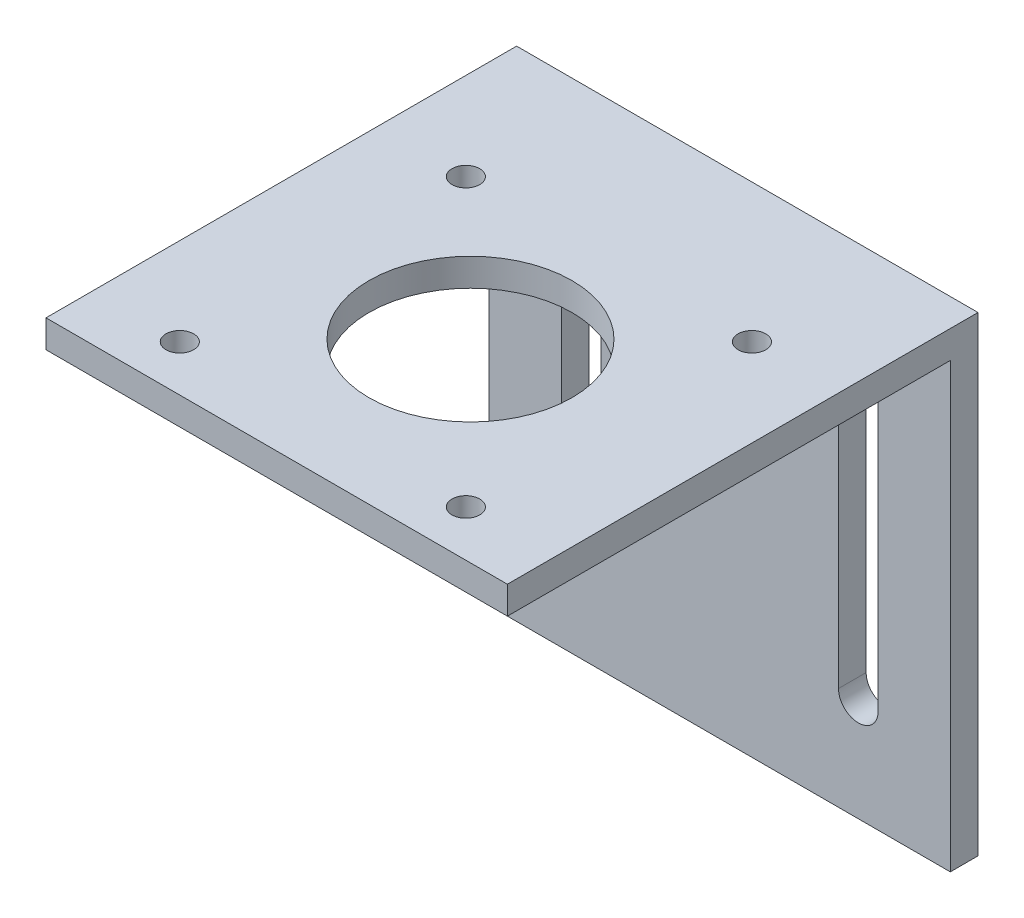
ISO-10303-21;
HEADER;
FILE_DESCRIPTION(('STEP AP214'),'2;1');
FILE_NAME('part.step','',(''),(''),'','','');
FILE_SCHEMA(('AUTOMOTIVE_DESIGN { 1 0 10303 214 1 1 1 1 }'));
ENDSEC;
DATA;
#1=APPLICATION_CONTEXT('core data for automotive mechanical design processes');
#2=APPLICATION_PROTOCOL_DEFINITION('international standard','automotive_design',2000,#1);
#3=PRODUCT_CONTEXT('',#1,'mechanical');
#4=PRODUCT('Part','Part','',(#3));
#5=PRODUCT_RELATED_PRODUCT_CATEGORY('part','',(#4));
#6=PRODUCT_DEFINITION_FORMATION('','',#4);
#7=PRODUCT_DEFINITION_CONTEXT('part definition',#1,'design');
#8=PRODUCT_DEFINITION('design','',#6,#7);
#9=PRODUCT_DEFINITION_SHAPE('','',#8);
#10=(LENGTH_UNIT() NAMED_UNIT(*) SI_UNIT(.MILLI.,.METRE.));
#11=(NAMED_UNIT(*) PLANE_ANGLE_UNIT() SI_UNIT($,.RADIAN.));
#12=(NAMED_UNIT(*) SI_UNIT($,.STERADIAN.) SOLID_ANGLE_UNIT());
#13=UNCERTAINTY_MEASURE_WITH_UNIT(LENGTH_MEASURE(1.E-05),#10,'distance_accuracy_value','');
#14=(GEOMETRIC_REPRESENTATION_CONTEXT(3) GLOBAL_UNCERTAINTY_ASSIGNED_CONTEXT((#13)) GLOBAL_UNIT_ASSIGNED_CONTEXT((#10,
#11,#12)) REPRESENTATION_CONTEXT('',''));
#15=CARTESIAN_POINT('',(0.,0.,0.));
#16=DIRECTION('',(0.,0.,1.));
#17=DIRECTION('',(1.,0.,0.));
#18=AXIS2_PLACEMENT_3D('',#15,#16,#17);
#19=CARTESIAN_POINT('',(0.,0.,3.));
#20=DIRECTION('',(0.,0.,-1.));
#21=DIRECTION('',(-1.,0.,0.));
#22=AXIS2_PLACEMENT_3D('',#19,#20,#21);
#23=PLANE('',#22);
#24=CARTESIAN_POINT('',(15.03,15.35,3.));
#25=DIRECTION('',(0.,0.,1.));
#26=DIRECTION('',(-1.,0.,0.));
#27=AXIS2_PLACEMENT_3D('',#24,#25,#26);
#28=CIRCLE('',#27,2.15000000000001);
#29=CARTESIAN_POINT('',(17.18,15.35,3.));
#30=VERTEX_POINT('',#29);
#31=CARTESIAN_POINT('',(12.88,15.35,3.));
#32=VERTEX_POINT('',#31);
#33=EDGE_CURVE('E172',#30,#32,#28,.T.);
#34=ORIENTED_EDGE('',*,*,#33,.F.);
#35=DIRECTION('',(0.,1.,0.));
#36=VECTOR('',#35,1.);
#37=CARTESIAN_POINT('',(17.18,15.35,3.));
#38=LINE('',#37,#36);
#39=CARTESIAN_POINT('',(17.18,-14.35,3.));
#40=VERTEX_POINT('',#39);
#41=EDGE_CURVE('E179',#40,#30,#38,.T.);
#42=ORIENTED_EDGE('',*,*,#41,.F.);
#43=CARTESIAN_POINT('',(15.03,-14.35,3.));
#44=DIRECTION('',(0.,0.,1.));
#45=DIRECTION('',(1.,0.,0.));
#46=AXIS2_PLACEMENT_3D('',#43,#44,#45);
#47=CIRCLE('',#46,2.15000000000001);
#48=CARTESIAN_POINT('',(12.88,-14.35,3.));
#49=VERTEX_POINT('',#48);
#50=EDGE_CURVE('E177',#49,#40,#47,.T.);
#51=ORIENTED_EDGE('',*,*,#50,.F.);
#52=DIRECTION('',(0.,-1.,0.));
#53=VECTOR('',#52,1.);
#54=CARTESIAN_POINT('',(12.88,15.35,3.));
#55=LINE('',#54,#53);
#56=EDGE_CURVE('E174',#32,#49,#55,.T.);
#57=ORIENTED_EDGE('',*,*,#56,.F.);
#58=EDGE_LOOP('',(#34,#42,#51,#57));
#59=FACE_BOUND('',#58,.T.);
#60=CARTESIAN_POINT('',(-15.,15.35,3.));
#61=DIRECTION('',(0.,0.,1.));
#62=DIRECTION('',(-1.,0.,0.));
#63=AXIS2_PLACEMENT_3D('',#60,#61,#62);
#64=CIRCLE('',#63,2.15);
#65=CARTESIAN_POINT('',(-12.85,15.35,3.));
#66=VERTEX_POINT('',#65);
#67=CARTESIAN_POINT('',(-17.15,15.35,3.));
#68=VERTEX_POINT('',#67);
#69=EDGE_CURVE('E198',#66,#68,#64,.T.);
#70=ORIENTED_EDGE('',*,*,#69,.F.);
#71=DIRECTION('',(0.,1.,0.));
#72=VECTOR('',#71,1.);
#73=CARTESIAN_POINT('',(-12.85,15.35,3.));
#74=LINE('',#73,#72);
#75=CARTESIAN_POINT('',(-12.85,-14.35,3.));
#76=VERTEX_POINT('',#75);
#77=EDGE_CURVE('E206',#76,#66,#74,.T.);
#78=ORIENTED_EDGE('',*,*,#77,.F.);
#79=CARTESIAN_POINT('',(-15.,-14.35,3.));
#80=DIRECTION('',(0.,0.,1.));
#81=DIRECTION('',(1.,0.,0.));
#82=AXIS2_PLACEMENT_3D('',#79,#80,#81);
#83=CIRCLE('',#82,2.15);
#84=CARTESIAN_POINT('',(-17.15,-14.35,3.));
#85=VERTEX_POINT('',#84);
#86=EDGE_CURVE('E203',#85,#76,#83,.T.);
#87=ORIENTED_EDGE('',*,*,#86,.F.);
#88=DIRECTION('',(0.,-1.,0.));
#89=VECTOR('',#88,1.);
#90=CARTESIAN_POINT('',(-17.15,15.35,3.));
#91=LINE('',#90,#89);
#92=EDGE_CURVE('E200',#68,#85,#91,.T.);
#93=ORIENTED_EDGE('',*,*,#92,.F.);
#94=EDGE_LOOP('',(#70,#78,#87,#93));
#95=FACE_BOUND('',#94,.T.);
#96=DIRECTION('',(1.,0.,0.));
#97=VECTOR('',#96,1.);
#98=CARTESIAN_POINT('',(-25.,22.5,3.));
#99=LINE('',#98,#97);
#100=CARTESIAN_POINT('',(-25.,22.5,3.));
#101=VERTEX_POINT('',#100);
#102=CARTESIAN_POINT('',(25.,22.5,3.));
#103=VERTEX_POINT('',#102);
#104=EDGE_CURVE('E54',#101,#103,#99,.T.);
#105=ORIENTED_EDGE('',*,*,#104,.F.);
#106=DIRECTION('',(0.,-1.,0.));
#107=VECTOR('',#106,1.);
#108=CARTESIAN_POINT('',(-25.,-25.5,3.));
#109=LINE('',#108,#107);
#110=CARTESIAN_POINT('',(-25.,-25.5,3.));
#111=VERTEX_POINT('',#110);
#112=EDGE_CURVE('E163',#101,#111,#109,.T.);
#113=ORIENTED_EDGE('',*,*,#112,.T.);
#114=DIRECTION('',(1.,0.,0.));
#115=VECTOR('',#114,1.);
#116=CARTESIAN_POINT('',(-25.,-25.5,3.));
#117=LINE('',#116,#115);
#118=CARTESIAN_POINT('',(25.,-25.5,3.));
#119=VERTEX_POINT('',#118);
#120=EDGE_CURVE('E233',#111,#119,#117,.T.);
#121=ORIENTED_EDGE('',*,*,#120,.T.);
#122=DIRECTION('',(0.,1.,0.));
#123=VECTOR('',#122,1.);
#124=CARTESIAN_POINT('',(25.,-25.5,3.));
#125=LINE('',#124,#123);
#126=EDGE_CURVE('E229',#119,#103,#125,.T.);
#127=ORIENTED_EDGE('',*,*,#126,.T.);
#128=EDGE_LOOP('',(#105,#113,#121,#127));
#129=FACE_BOUND('',#128,.T.);
#130=ADVANCED_FACE('F37',(#59,#95,#129),#23,.F.);
#131=CARTESIAN_POINT('',(0.,0.,0.));
#132=DIRECTION('',(0.,0.,-1.));
#133=DIRECTION('',(-1.,0.,0.));
#134=AXIS2_PLACEMENT_3D('',#131,#132,#133);
#135=PLANE('',#134);
#136=DIRECTION('',(0.,1.,0.));
#137=VECTOR('',#136,1.);
#138=CARTESIAN_POINT('',(25.,-25.5,0.));
#139=LINE('',#138,#137);
#140=CARTESIAN_POINT('',(25.,-25.5,0.));
#141=VERTEX_POINT('',#140);
#142=CARTESIAN_POINT('',(25.,25.5,0.));
#143=VERTEX_POINT('',#142);
#144=EDGE_CURVE('E228',#141,#143,#139,.T.);
#145=ORIENTED_EDGE('',*,*,#144,.F.);
#146=DIRECTION('',(1.,0.,0.));
#147=VECTOR('',#146,1.);
#148=CARTESIAN_POINT('',(-25.,-25.5,0.));
#149=LINE('',#148,#147);
#150=CARTESIAN_POINT('',(-25.,-25.5,0.));
#151=VERTEX_POINT('',#150);
#152=EDGE_CURVE('E231',#151,#141,#149,.T.);
#153=ORIENTED_EDGE('',*,*,#152,.F.);
#154=DIRECTION('',(0.,-1.,0.));
#155=VECTOR('',#154,1.);
#156=CARTESIAN_POINT('',(-25.,-25.5,0.));
#157=LINE('',#156,#155);
#158=CARTESIAN_POINT('',(-25.,25.5,0.));
#159=VERTEX_POINT('',#158);
#160=EDGE_CURVE('E240',#159,#151,#157,.T.);
#161=ORIENTED_EDGE('',*,*,#160,.F.);
#162=DIRECTION('',(-1.,0.,0.));
#163=VECTOR('',#162,1.);
#164=CARTESIAN_POINT('',(-25.,25.5,0.));
#165=LINE('',#164,#163);
#166=EDGE_CURVE('E238',#143,#159,#165,.T.);
#167=ORIENTED_EDGE('',*,*,#166,.F.);
#168=EDGE_LOOP('',(#145,#153,#161,#167));
#169=FACE_BOUND('',#168,.T.);
#170=DIRECTION('',(0.,1.,0.));
#171=VECTOR('',#170,1.);
#172=CARTESIAN_POINT('',(-12.85,15.35,0.));
#173=LINE('',#172,#171);
#174=CARTESIAN_POINT('',(-12.85,-14.35,0.));
#175=VERTEX_POINT('',#174);
#176=CARTESIAN_POINT('',(-12.85,15.35,0.));
#177=VERTEX_POINT('',#176);
#178=EDGE_CURVE('E201',#175,#177,#173,.T.);
#179=ORIENTED_EDGE('',*,*,#178,.T.);
#180=CARTESIAN_POINT('',(-15.,15.35,0.));
#181=DIRECTION('',(0.,0.,1.));
#182=DIRECTION('',(-1.,0.,0.));
#183=AXIS2_PLACEMENT_3D('',#180,#181,#182);
#184=CIRCLE('',#183,2.15);
#185=CARTESIAN_POINT('',(-17.15,15.35,0.));
#186=VERTEX_POINT('',#185);
#187=EDGE_CURVE('E197',#177,#186,#184,.T.);
#188=ORIENTED_EDGE('',*,*,#187,.T.);
#189=DIRECTION('',(0.,-1.,0.));
#190=VECTOR('',#189,1.);
#191=CARTESIAN_POINT('',(-17.15,15.35,0.));
#192=LINE('',#191,#190);
#193=CARTESIAN_POINT('',(-17.15,-14.35,0.));
#194=VERTEX_POINT('',#193);
#195=EDGE_CURVE('E211',#186,#194,#192,.T.);
#196=ORIENTED_EDGE('',*,*,#195,.T.);
#197=CARTESIAN_POINT('',(-15.,-14.35,0.));
#198=DIRECTION('',(0.,0.,1.));
#199=DIRECTION('',(1.,0.,0.));
#200=AXIS2_PLACEMENT_3D('',#197,#198,#199);
#201=CIRCLE('',#200,2.15);
#202=EDGE_CURVE('E214',#194,#175,#201,.T.);
#203=ORIENTED_EDGE('',*,*,#202,.T.);
#204=EDGE_LOOP('',(#179,#188,#196,#203));
#205=FACE_BOUND('',#204,.T.);
#206=DIRECTION('',(0.,1.,0.));
#207=VECTOR('',#206,1.);
#208=CARTESIAN_POINT('',(17.18,15.35,0.));
#209=LINE('',#208,#207);
#210=CARTESIAN_POINT('',(17.18,-14.35,0.));
#211=VERTEX_POINT('',#210);
#212=CARTESIAN_POINT('',(17.18,15.35,0.));
#213=VERTEX_POINT('',#212);
#214=EDGE_CURVE('E175',#211,#213,#209,.T.);
#215=ORIENTED_EDGE('',*,*,#214,.T.);
#216=CARTESIAN_POINT('',(15.03,15.35,0.));
#217=DIRECTION('',(0.,0.,1.));
#218=DIRECTION('',(-1.,0.,0.));
#219=AXIS2_PLACEMENT_3D('',#216,#217,#218);
#220=CIRCLE('',#219,2.15000000000001);
#221=CARTESIAN_POINT('',(12.88,15.35,0.));
#222=VERTEX_POINT('',#221);
#223=EDGE_CURVE('E164',#213,#222,#220,.T.);
#224=ORIENTED_EDGE('',*,*,#223,.T.);
#225=DIRECTION('',(0.,-1.,0.));
#226=VECTOR('',#225,1.);
#227=CARTESIAN_POINT('',(12.88,15.35,0.));
#228=LINE('',#227,#226);
#229=CARTESIAN_POINT('',(12.88,-14.35,0.));
#230=VERTEX_POINT('',#229);
#231=EDGE_CURVE('E167',#222,#230,#228,.T.);
#232=ORIENTED_EDGE('',*,*,#231,.T.);
#233=CARTESIAN_POINT('',(15.03,-14.35,0.));
#234=DIRECTION('',(0.,0.,1.));
#235=DIRECTION('',(1.,0.,0.));
#236=AXIS2_PLACEMENT_3D('',#233,#234,#235);
#237=CIRCLE('',#236,2.15000000000001);
#238=EDGE_CURVE('E184',#230,#211,#237,.T.);
#239=ORIENTED_EDGE('',*,*,#238,.T.);
#240=EDGE_LOOP('',(#215,#224,#232,#239));
#241=FACE_BOUND('',#240,.T.);
#242=ADVANCED_FACE('F310',(#169,#205,#241),#135,.T.);
#243=CARTESIAN_POINT('',(25.,-25.5,3.));
#244=DIRECTION('',(-1.,0.,0.));
#245=DIRECTION('',(0.,0.,1.));
#246=AXIS2_PLACEMENT_3D('',#243,#244,#245);
#247=PLANE('',#246);
#248=ORIENTED_EDGE('',*,*,#144,.T.);
#249=DIRECTION('',(0.,0.,-1.));
#250=VECTOR('',#249,1.);
#251=CARTESIAN_POINT('',(25.,25.5,3.));
#252=LINE('',#251,#250);
#253=CARTESIAN_POINT('',(25.,25.5,51.));
#254=VERTEX_POINT('',#253);
#255=EDGE_CURVE('E11',#254,#143,#252,.T.);
#256=ORIENTED_EDGE('',*,*,#255,.F.);
#257=DIRECTION('',(0.,1.,0.));
#258=VECTOR('',#257,1.);
#259=CARTESIAN_POINT('',(25.,25.5,51.));
#260=LINE('',#259,#258);
#261=CARTESIAN_POINT('',(25.,22.5,51.));
#262=VERTEX_POINT('',#261);
#263=EDGE_CURVE('E150',#262,#254,#260,.T.);
#264=ORIENTED_EDGE('',*,*,#263,.F.);
#265=DIRECTION('',(0.,0.,-1.));
#266=VECTOR('',#265,1.);
#267=CARTESIAN_POINT('',(25.,22.5,51.));
#268=LINE('',#267,#266);
#269=EDGE_CURVE('E146',#262,#103,#268,.T.);
#270=ORIENTED_EDGE('',*,*,#269,.T.);
#271=ORIENTED_EDGE('',*,*,#126,.F.);
#272=DIRECTION('',(0.,0.,-1.));
#273=VECTOR('',#272,1.);
#274=CARTESIAN_POINT('',(25.,-25.5,3.));
#275=LINE('',#274,#273);
#276=EDGE_CURVE('E235',#119,#141,#275,.T.);
#277=ORIENTED_EDGE('',*,*,#276,.T.);
#278=EDGE_LOOP('',(#248,#256,#264,#270,#271,#277));
#279=FACE_BOUND('',#278,.T.);
#280=ADVANCED_FACE('F39',(#279),#247,.F.);
#281=CARTESIAN_POINT('',(-25.,25.5,3.));
#282=DIRECTION('',(0.,-1.,0.));
#283=DIRECTION('',(0.,0.,-1.));
#284=AXIS2_PLACEMENT_3D('',#281,#282,#283);
#285=PLANE('',#284);
#286=CARTESIAN_POINT('',(15.5,25.5,15.));
#287=DIRECTION('',(0.,-1.,0.));
#288=DIRECTION('',(1.,0.,0.));
#289=AXIS2_PLACEMENT_3D('',#286,#287,#288);
#290=CIRCLE('',#289,1.5);
#291=CARTESIAN_POINT('',(17.,25.5,15.));
#292=VERTEX_POINT('',#291);
#293=EDGE_CURVE('E271',#292,#292,#290,.T.);
#294=ORIENTED_EDGE('',*,*,#293,.T.);
#295=EDGE_LOOP('',(#294));
#296=FACE_BOUND('',#295,.T.);
#297=CARTESIAN_POINT('',(-15.5,25.5,15.));
#298=DIRECTION('',(0.,-1.,0.));
#299=DIRECTION('',(1.,0.,0.));
#300=AXIS2_PLACEMENT_3D('',#297,#298,#299);
#301=CIRCLE('',#300,1.5);
#302=CARTESIAN_POINT('',(-14.,25.5,15.));
#303=VERTEX_POINT('',#302);
#304=EDGE_CURVE('E274',#303,#303,#301,.T.);
#305=ORIENTED_EDGE('',*,*,#304,.T.);
#306=EDGE_LOOP('',(#305));
#307=FACE_BOUND('',#306,.T.);
#308=CARTESIAN_POINT('',(15.5,25.5,46.));
#309=DIRECTION('',(0.,-1.,0.));
#310=DIRECTION('',(1.,0.,0.));
#311=AXIS2_PLACEMENT_3D('',#308,#309,#310);
#312=CIRCLE('',#311,1.5);
#313=CARTESIAN_POINT('',(17.,25.5,46.));
#314=VERTEX_POINT('',#313);
#315=EDGE_CURVE('E277',#314,#314,#312,.T.);
#316=ORIENTED_EDGE('',*,*,#315,.T.);
#317=EDGE_LOOP('',(#316));
#318=FACE_BOUND('',#317,.T.);
#319=CARTESIAN_POINT('',(-15.5,25.5,46.));
#320=DIRECTION('',(0.,-1.,0.));
#321=DIRECTION('',(1.,0.,0.));
#322=AXIS2_PLACEMENT_3D('',#319,#320,#321);
#323=CIRCLE('',#322,1.5);
#324=CARTESIAN_POINT('',(-14.,25.5,46.));
#325=VERTEX_POINT('',#324);
#326=EDGE_CURVE('E270',#325,#325,#323,.T.);
#327=ORIENTED_EDGE('',*,*,#326,.T.);
#328=EDGE_LOOP('',(#327));
#329=FACE_BOUND('',#328,.T.);
#330=CARTESIAN_POINT('',(0.,25.5,30.));
#331=DIRECTION('',(0.,-1.,0.));
#332=DIRECTION('',(1.,0.,0.));
#333=AXIS2_PLACEMENT_3D('',#330,#331,#332);
#334=CIRCLE('',#333,11.);
#335=CARTESIAN_POINT('',(11.,25.5,30.));
#336=VERTEX_POINT('',#335);
#337=EDGE_CURVE('E253',#336,#336,#334,.T.);
#338=ORIENTED_EDGE('',*,*,#337,.T.);
#339=EDGE_LOOP('',(#338));
#340=FACE_BOUND('',#339,.T.);
#341=ORIENTED_EDGE('',*,*,#166,.T.);
#342=DIRECTION('',(0.,0.,-1.));
#343=VECTOR('',#342,1.);
#344=CARTESIAN_POINT('',(-25.,25.5,3.));
#345=LINE('',#344,#343);
#346=CARTESIAN_POINT('',(-25.,25.5,51.));
#347=VERTEX_POINT('',#346);
#348=EDGE_CURVE('E46',#347,#159,#345,.T.);
#349=ORIENTED_EDGE('',*,*,#348,.F.);
#350=DIRECTION('',(-1.,0.,0.));
#351=VECTOR('',#350,1.);
#352=CARTESIAN_POINT('',(-25.,25.5,51.));
#353=LINE('',#352,#351);
#354=EDGE_CURVE('E157',#254,#347,#353,.T.);
#355=ORIENTED_EDGE('',*,*,#354,.F.);
#356=ORIENTED_EDGE('',*,*,#255,.T.);
#357=EDGE_LOOP('',(#341,#349,#355,#356));
#358=FACE_BOUND('',#357,.T.);
#359=ADVANCED_FACE('F283',(#296,#307,#318,#329,#340,#358),#285,.F.);
#360=CARTESIAN_POINT('',(-25.,-25.5,3.));
#361=DIRECTION('',(1.,0.,0.));
#362=DIRECTION('',(0.,0.,-1.));
#363=AXIS2_PLACEMENT_3D('',#360,#361,#362);
#364=PLANE('',#363);
#365=ORIENTED_EDGE('',*,*,#160,.T.);
#366=DIRECTION('',(0.,0.,-1.));
#367=VECTOR('',#366,1.);
#368=CARTESIAN_POINT('',(-25.,-25.5,3.));
#369=LINE('',#368,#367);
#370=EDGE_CURVE('E245',#111,#151,#369,.T.);
#371=ORIENTED_EDGE('',*,*,#370,.F.);
#372=ORIENTED_EDGE('',*,*,#112,.F.);
#373=DIRECTION('',(0.,0.,-1.));
#374=VECTOR('',#373,1.);
#375=CARTESIAN_POINT('',(-25.,22.5,51.));
#376=LINE('',#375,#374);
#377=CARTESIAN_POINT('',(-25.,22.5,51.));
#378=VERTEX_POINT('',#377);
#379=EDGE_CURVE('E144',#378,#101,#376,.T.);
#380=ORIENTED_EDGE('',*,*,#379,.F.);
#381=DIRECTION('',(0.,-1.,0.));
#382=VECTOR('',#381,1.);
#383=CARTESIAN_POINT('',(-25.,25.5,51.));
#384=LINE('',#383,#382);
#385=EDGE_CURVE('E151',#347,#378,#384,.T.);
#386=ORIENTED_EDGE('',*,*,#385,.F.);
#387=ORIENTED_EDGE('',*,*,#348,.T.);
#388=EDGE_LOOP('',(#365,#371,#372,#380,#386,#387));
#389=FACE_BOUND('',#388,.T.);
#390=ADVANCED_FACE('F161',(#389),#364,.F.);
#391=CARTESIAN_POINT('',(-25.,-25.5,3.));
#392=DIRECTION('',(0.,1.,0.));
#393=DIRECTION('',(0.,0.,1.));
#394=AXIS2_PLACEMENT_3D('',#391,#392,#393);
#395=PLANE('',#394);
#396=ORIENTED_EDGE('',*,*,#152,.T.);
#397=ORIENTED_EDGE('',*,*,#276,.F.);
#398=ORIENTED_EDGE('',*,*,#120,.F.);
#399=ORIENTED_EDGE('',*,*,#370,.T.);
#400=EDGE_LOOP('',(#396,#397,#398,#399));
#401=FACE_BOUND('',#400,.T.);
#402=ADVANCED_FACE('F324',(#401),#395,.F.);
#403=CARTESIAN_POINT('',(-15.,15.35,3.));
#404=DIRECTION('',(0.,0.,-1.));
#405=DIRECTION('',(-1.,0.,0.));
#406=AXIS2_PLACEMENT_3D('',#403,#404,#405);
#407=CYLINDRICAL_SURFACE('',#406,2.15);
#408=ORIENTED_EDGE('',*,*,#187,.F.);
#409=DIRECTION('',(0.,0.,-1.));
#410=VECTOR('',#409,1.);
#411=CARTESIAN_POINT('',(-12.85,15.35,3.));
#412=LINE('',#411,#410);
#413=EDGE_CURVE('E208',#66,#177,#412,.T.);
#414=ORIENTED_EDGE('',*,*,#413,.F.);
#415=ORIENTED_EDGE('',*,*,#69,.T.);
#416=DIRECTION('',(0.,0.,-1.));
#417=VECTOR('',#416,1.);
#418=CARTESIAN_POINT('',(-17.15,15.35,3.));
#419=LINE('',#418,#417);
#420=EDGE_CURVE('E225',#68,#186,#419,.T.);
#421=ORIENTED_EDGE('',*,*,#420,.T.);
#422=EDGE_LOOP('',(#408,#414,#415,#421));
#423=FACE_BOUND('',#422,.T.);
#424=ADVANCED_FACE('F321',(#423),#407,.F.);
#425=CARTESIAN_POINT('',(-17.15,15.35,3.));
#426=DIRECTION('',(1.,0.,0.));
#427=DIRECTION('',(0.,1.,0.));
#428=AXIS2_PLACEMENT_3D('',#425,#426,#427);
#429=PLANE('',#428);
#430=ORIENTED_EDGE('',*,*,#195,.F.);
#431=ORIENTED_EDGE('',*,*,#420,.F.);
#432=ORIENTED_EDGE('',*,*,#92,.T.);
#433=DIRECTION('',(0.,0.,-1.));
#434=VECTOR('',#433,1.);
#435=CARTESIAN_POINT('',(-17.15,-14.35,3.));
#436=LINE('',#435,#434);
#437=EDGE_CURVE('E223',#85,#194,#436,.T.);
#438=ORIENTED_EDGE('',*,*,#437,.T.);
#439=EDGE_LOOP('',(#430,#431,#432,#438));
#440=FACE_BOUND('',#439,.T.);
#441=ADVANCED_FACE('F480',(#440),#429,.T.);
#442=CARTESIAN_POINT('',(-15.,-14.35,3.));
#443=DIRECTION('',(0.,0.,-1.));
#444=DIRECTION('',(-1.,0.,0.));
#445=AXIS2_PLACEMENT_3D('',#442,#443,#444);
#446=CYLINDRICAL_SURFACE('',#445,2.15);
#447=ORIENTED_EDGE('',*,*,#202,.F.);
#448=ORIENTED_EDGE('',*,*,#437,.F.);
#449=ORIENTED_EDGE('',*,*,#86,.T.);
#450=DIRECTION('',(0.,0.,-1.));
#451=VECTOR('',#450,1.);
#452=CARTESIAN_POINT('',(-12.85,-14.35,3.));
#453=LINE('',#452,#451);
#454=EDGE_CURVE('E221',#76,#175,#453,.T.);
#455=ORIENTED_EDGE('',*,*,#454,.T.);
#456=EDGE_LOOP('',(#447,#448,#449,#455));
#457=FACE_BOUND('',#456,.T.);
#458=ADVANCED_FACE('F469',(#457),#446,.F.);
#459=CARTESIAN_POINT('',(-12.85,15.35,3.));
#460=DIRECTION('',(-1.,0.,0.));
#461=DIRECTION('',(0.,-1.,0.));
#462=AXIS2_PLACEMENT_3D('',#459,#460,#461);
#463=PLANE('',#462);
#464=ORIENTED_EDGE('',*,*,#178,.F.);
#465=ORIENTED_EDGE('',*,*,#454,.F.);
#466=ORIENTED_EDGE('',*,*,#77,.T.);
#467=ORIENTED_EDGE('',*,*,#413,.T.);
#468=EDGE_LOOP('',(#464,#465,#466,#467));
#469=FACE_BOUND('',#468,.T.);
#470=ADVANCED_FACE('F458',(#469),#463,.T.);
#471=CARTESIAN_POINT('',(15.03,15.35,3.));
#472=DIRECTION('',(0.,0.,-1.));
#473=DIRECTION('',(-1.,0.,0.));
#474=AXIS2_PLACEMENT_3D('',#471,#472,#473);
#475=CYLINDRICAL_SURFACE('',#474,2.15000000000001);
#476=ORIENTED_EDGE('',*,*,#223,.F.);
#477=DIRECTION('',(0.,0.,-1.));
#478=VECTOR('',#477,1.);
#479=CARTESIAN_POINT('',(17.18,15.35,3.));
#480=LINE('',#479,#478);
#481=EDGE_CURVE('E180',#30,#213,#480,.T.);
#482=ORIENTED_EDGE('',*,*,#481,.F.);
#483=ORIENTED_EDGE('',*,*,#33,.T.);
#484=DIRECTION('',(0.,0.,-1.));
#485=VECTOR('',#484,1.);
#486=CARTESIAN_POINT('',(12.88,15.35,3.));
#487=LINE('',#486,#485);
#488=EDGE_CURVE('E194',#32,#222,#487,.T.);
#489=ORIENTED_EDGE('',*,*,#488,.T.);
#490=EDGE_LOOP('',(#476,#482,#483,#489));
#491=FACE_BOUND('',#490,.T.);
#492=ADVANCED_FACE('F447',(#491),#475,.F.);
#493=CARTESIAN_POINT('',(12.88,15.35,3.));
#494=DIRECTION('',(1.,0.,0.));
#495=DIRECTION('',(0.,1.,0.));
#496=AXIS2_PLACEMENT_3D('',#493,#494,#495);
#497=PLANE('',#496);
#498=ORIENTED_EDGE('',*,*,#231,.F.);
#499=ORIENTED_EDGE('',*,*,#488,.F.);
#500=ORIENTED_EDGE('',*,*,#56,.T.);
#501=DIRECTION('',(0.,0.,-1.));
#502=VECTOR('',#501,1.);
#503=CARTESIAN_POINT('',(12.88,-14.35,3.));
#504=LINE('',#503,#502);
#505=EDGE_CURVE('E192',#49,#230,#504,.T.);
#506=ORIENTED_EDGE('',*,*,#505,.T.);
#507=EDGE_LOOP('',(#498,#499,#500,#506));
#508=FACE_BOUND('',#507,.T.);
#509=ADVANCED_FACE('F436',(#508),#497,.T.);
#510=CARTESIAN_POINT('',(15.03,-14.35,3.));
#511=DIRECTION('',(0.,0.,-1.));
#512=DIRECTION('',(-1.,0.,0.));
#513=AXIS2_PLACEMENT_3D('',#510,#511,#512);
#514=CYLINDRICAL_SURFACE('',#513,2.15000000000001);
#515=ORIENTED_EDGE('',*,*,#238,.F.);
#516=ORIENTED_EDGE('',*,*,#505,.F.);
#517=ORIENTED_EDGE('',*,*,#50,.T.);
#518=DIRECTION('',(0.,0.,-1.));
#519=VECTOR('',#518,1.);
#520=CARTESIAN_POINT('',(17.18,-14.35,3.));
#521=LINE('',#520,#519);
#522=EDGE_CURVE('E62',#40,#211,#521,.T.);
#523=ORIENTED_EDGE('',*,*,#522,.T.);
#524=EDGE_LOOP('',(#515,#516,#517,#523));
#525=FACE_BOUND('',#524,.T.);
#526=ADVANCED_FACE('F427',(#525),#514,.F.);
#527=CARTESIAN_POINT('',(17.18,15.35,3.));
#528=DIRECTION('',(-1.,0.,0.));
#529=DIRECTION('',(0.,-1.,0.));
#530=AXIS2_PLACEMENT_3D('',#527,#528,#529);
#531=PLANE('',#530);
#532=ORIENTED_EDGE('',*,*,#214,.F.);
#533=ORIENTED_EDGE('',*,*,#522,.F.);
#534=ORIENTED_EDGE('',*,*,#41,.T.);
#535=ORIENTED_EDGE('',*,*,#481,.T.);
#536=EDGE_LOOP('',(#532,#533,#534,#535));
#537=FACE_BOUND('',#536,.T.);
#538=ADVANCED_FACE('F296',(#537),#531,.T.);
#539=CARTESIAN_POINT('',(-25.,22.5,51.));
#540=DIRECTION('',(0.,1.,0.));
#541=DIRECTION('',(-1.,0.,0.));
#542=AXIS2_PLACEMENT_3D('',#539,#540,#541);
#543=PLANE('',#542);
#544=CARTESIAN_POINT('',(15.5,22.5,15.));
#545=DIRECTION('',(0.,1.,0.));
#546=DIRECTION('',(-1.,0.,0.));
#547=AXIS2_PLACEMENT_3D('',#544,#545,#546);
#548=CIRCLE('',#547,1.5);
#549=CARTESIAN_POINT('',(14.,22.5,15.));
#550=VERTEX_POINT('',#549);
#551=EDGE_CURVE('E41',#550,#550,#548,.T.);
#552=ORIENTED_EDGE('',*,*,#551,.T.);
#553=EDGE_LOOP('',(#552));
#554=FACE_BOUND('',#553,.T.);
#555=CARTESIAN_POINT('',(-15.5,22.5,15.));
#556=DIRECTION('',(0.,1.,0.));
#557=DIRECTION('',(-1.,0.,0.));
#558=AXIS2_PLACEMENT_3D('',#555,#556,#557);
#559=CIRCLE('',#558,1.5);
#560=CARTESIAN_POINT('',(-17.,22.5,15.));
#561=VERTEX_POINT('',#560);
#562=EDGE_CURVE('E258',#561,#561,#559,.T.);
#563=ORIENTED_EDGE('',*,*,#562,.T.);
#564=EDGE_LOOP('',(#563));
#565=FACE_BOUND('',#564,.T.);
#566=CARTESIAN_POINT('',(15.5,22.5,46.));
#567=DIRECTION('',(0.,1.,0.));
#568=DIRECTION('',(-1.,0.,0.));
#569=AXIS2_PLACEMENT_3D('',#566,#567,#568);
#570=CIRCLE('',#569,1.5);
#571=CARTESIAN_POINT('',(14.,22.5,46.));
#572=VERTEX_POINT('',#571);
#573=EDGE_CURVE('E256',#572,#572,#570,.T.);
#574=ORIENTED_EDGE('',*,*,#573,.T.);
#575=EDGE_LOOP('',(#574));
#576=FACE_BOUND('',#575,.T.);
#577=CARTESIAN_POINT('',(-15.5,22.5,46.));
#578=DIRECTION('',(0.,1.,0.));
#579=DIRECTION('',(-1.,0.,0.));
#580=AXIS2_PLACEMENT_3D('',#577,#578,#579);
#581=CIRCLE('',#580,1.5);
#582=CARTESIAN_POINT('',(-17.,22.5,46.));
#583=VERTEX_POINT('',#582);
#584=EDGE_CURVE('E252',#583,#583,#581,.T.);
#585=ORIENTED_EDGE('',*,*,#584,.T.);
#586=EDGE_LOOP('',(#585));
#587=FACE_BOUND('',#586,.T.);
#588=CARTESIAN_POINT('',(0.,22.5,30.));
#589=DIRECTION('',(0.,1.,0.));
#590=DIRECTION('',(-1.,0.,0.));
#591=AXIS2_PLACEMENT_3D('',#588,#589,#590);
#592=CIRCLE('',#591,11.);
#593=CARTESIAN_POINT('',(-11.,22.5,30.));
#594=VERTEX_POINT('',#593);
#595=EDGE_CURVE('E249',#594,#594,#592,.T.);
#596=ORIENTED_EDGE('',*,*,#595,.T.);
#597=EDGE_LOOP('',(#596));
#598=FACE_BOUND('',#597,.T.);
#599=ORIENTED_EDGE('',*,*,#104,.T.);
#600=ORIENTED_EDGE('',*,*,#269,.F.);
#601=DIRECTION('',(1.,0.,0.));
#602=VECTOR('',#601,1.);
#603=CARTESIAN_POINT('',(-25.,22.5,51.));
#604=LINE('',#603,#602);
#605=EDGE_CURVE('E140',#378,#262,#604,.T.);
#606=ORIENTED_EDGE('',*,*,#605,.F.);
#607=ORIENTED_EDGE('',*,*,#379,.T.);
#608=EDGE_LOOP('',(#599,#600,#606,#607));
#609=FACE_BOUND('',#608,.T.);
#610=ADVANCED_FACE('F142',(#554,#565,#576,#587,#598,#609),#543,.F.);
#611=CARTESIAN_POINT('',(0.,0.,51.));
#612=DIRECTION('',(0.,0.,1.));
#613=DIRECTION('',(1.,0.,0.));
#614=AXIS2_PLACEMENT_3D('',#611,#612,#613);
#615=PLANE('',#614);
#616=ORIENTED_EDGE('',*,*,#385,.T.);
#617=ORIENTED_EDGE('',*,*,#605,.T.);
#618=ORIENTED_EDGE('',*,*,#263,.T.);
#619=ORIENTED_EDGE('',*,*,#354,.T.);
#620=EDGE_LOOP('',(#616,#617,#618,#619));
#621=FACE_BOUND('',#620,.T.);
#622=ADVANCED_FACE('F155',(#621),#615,.T.);
#623=CARTESIAN_POINT('',(0.,25.5,30.));
#624=DIRECTION('',(0.,-1.,0.));
#625=DIRECTION('',(1.,0.,0.));
#626=AXIS2_PLACEMENT_3D('',#623,#624,#625);
#627=CYLINDRICAL_SURFACE('',#626,11.);
#628=ORIENTED_EDGE('',*,*,#337,.F.);
#629=EDGE_LOOP('',(#628));
#630=FACE_BOUND('',#629,.T.);
#631=ORIENTED_EDGE('',*,*,#595,.F.);
#632=EDGE_LOOP('',(#631));
#633=FACE_BOUND('',#632,.T.);
#634=ADVANCED_FACE('F290',(#630,#633),#627,.F.);
#635=CARTESIAN_POINT('',(-15.5,25.5,46.));
#636=DIRECTION('',(0.,-1.,0.));
#637=DIRECTION('',(1.,0.,0.));
#638=AXIS2_PLACEMENT_3D('',#635,#636,#637);
#639=CYLINDRICAL_SURFACE('',#638,1.5);
#640=ORIENTED_EDGE('',*,*,#326,.F.);
#641=EDGE_LOOP('',(#640));
#642=FACE_BOUND('',#641,.T.);
#643=ORIENTED_EDGE('',*,*,#584,.F.);
#644=EDGE_LOOP('',(#643));
#645=FACE_BOUND('',#644,.T.);
#646=ADVANCED_FACE('F286',(#642,#645),#639,.F.);
#647=CARTESIAN_POINT('',(15.5,25.5,46.));
#648=DIRECTION('',(0.,-1.,0.));
#649=DIRECTION('',(1.,0.,0.));
#650=AXIS2_PLACEMENT_3D('',#647,#648,#649);
#651=CYLINDRICAL_SURFACE('',#650,1.5);
#652=ORIENTED_EDGE('',*,*,#315,.F.);
#653=EDGE_LOOP('',(#652));
#654=FACE_BOUND('',#653,.T.);
#655=ORIENTED_EDGE('',*,*,#573,.F.);
#656=EDGE_LOOP('',(#655));
#657=FACE_BOUND('',#656,.T.);
#658=ADVANCED_FACE('F289',(#654,#657),#651,.F.);
#659=CARTESIAN_POINT('',(-15.5,25.5,15.));
#660=DIRECTION('',(0.,-1.,0.));
#661=DIRECTION('',(1.,0.,0.));
#662=AXIS2_PLACEMENT_3D('',#659,#660,#661);
#663=CYLINDRICAL_SURFACE('',#662,1.5);
#664=ORIENTED_EDGE('',*,*,#304,.F.);
#665=EDGE_LOOP('',(#664));
#666=FACE_BOUND('',#665,.T.);
#667=ORIENTED_EDGE('',*,*,#562,.F.);
#668=EDGE_LOOP('',(#667));
#669=FACE_BOUND('',#668,.T.);
#670=ADVANCED_FACE('F343',(#666,#669),#663,.F.);
#671=CARTESIAN_POINT('',(15.5,25.5,15.));
#672=DIRECTION('',(0.,-1.,0.));
#673=DIRECTION('',(1.,0.,0.));
#674=AXIS2_PLACEMENT_3D('',#671,#672,#673);
#675=CYLINDRICAL_SURFACE('',#674,1.5);
#676=ORIENTED_EDGE('',*,*,#293,.F.);
#677=EDGE_LOOP('',(#676));
#678=FACE_BOUND('',#677,.T.);
#679=ORIENTED_EDGE('',*,*,#551,.F.);
#680=EDGE_LOOP('',(#679));
#681=FACE_BOUND('',#680,.T.);
#682=ADVANCED_FACE('F350',(#678,#681),#675,.F.);
#683=CLOSED_SHELL('',(#130,#242,#280,#359,#390,#402,#424,#441,#458,#470,#492,#509,#526,#538,
#610,#622,#634,#646,#658,#670,#682));
#684=MANIFOLD_SOLID_BREP('B2',#683);
#685=ADVANCED_BREP_SHAPE_REPRESENTATION('',(#18,#684),#14);
#686=SHAPE_DEFINITION_REPRESENTATION(#9,#685);
ENDSEC;
END-ISO-10303-21;
